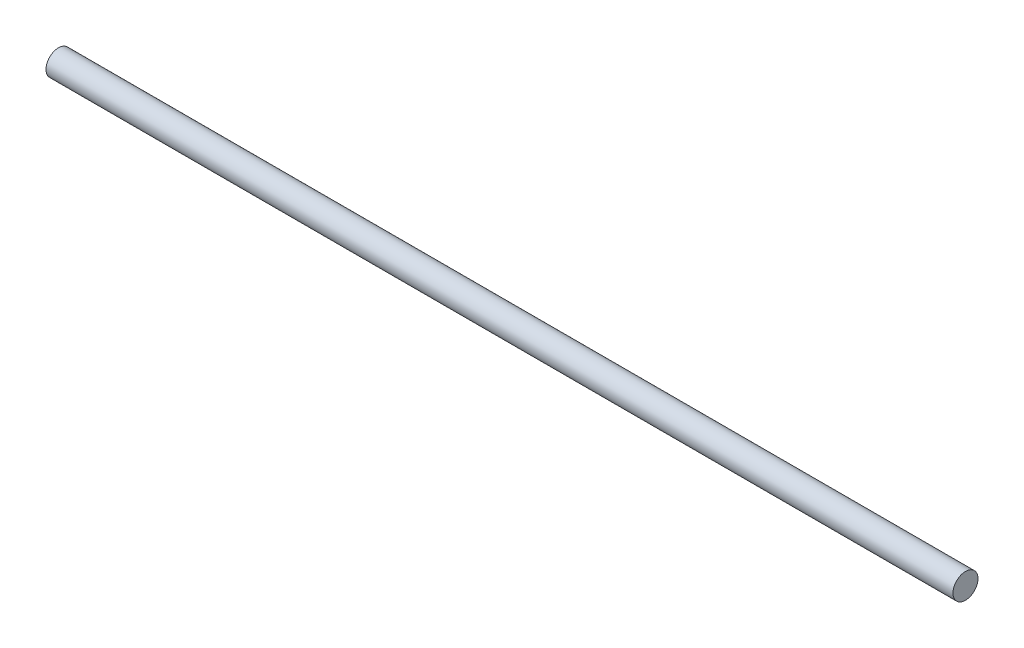
ISO-10303-21;
HEADER;
FILE_DESCRIPTION(('STEP AP214'),'2;1');
FILE_NAME('part.step','',(''),(''),'','','');
FILE_SCHEMA(('AUTOMOTIVE_DESIGN { 1 0 10303 214 1 1 1 1 }'));
ENDSEC;
DATA;
#1=APPLICATION_CONTEXT('core data for automotive mechanical design processes');
#2=APPLICATION_PROTOCOL_DEFINITION('international standard','automotive_design',2000,#1);
#3=PRODUCT_CONTEXT('',#1,'mechanical');
#4=PRODUCT('Part','Part','',(#3));
#5=PRODUCT_RELATED_PRODUCT_CATEGORY('part','',(#4));
#6=PRODUCT_DEFINITION_FORMATION('','',#4);
#7=PRODUCT_DEFINITION_CONTEXT('part definition',#1,'design');
#8=PRODUCT_DEFINITION('design','',#6,#7);
#9=PRODUCT_DEFINITION_SHAPE('','',#8);
#10=(LENGTH_UNIT() NAMED_UNIT(*) SI_UNIT(.MILLI.,.METRE.));
#11=(NAMED_UNIT(*) PLANE_ANGLE_UNIT() SI_UNIT($,.RADIAN.));
#12=(NAMED_UNIT(*) SI_UNIT($,.STERADIAN.) SOLID_ANGLE_UNIT());
#13=UNCERTAINTY_MEASURE_WITH_UNIT(LENGTH_MEASURE(1.E-05),#10,'distance_accuracy_value','');
#14=(GEOMETRIC_REPRESENTATION_CONTEXT(3) GLOBAL_UNCERTAINTY_ASSIGNED_CONTEXT((#13)) GLOBAL_UNIT_ASSIGNED_CONTEXT((#10,
#11,#12)) REPRESENTATION_CONTEXT('',''));
#15=CARTESIAN_POINT('',(0.,0.,0.));
#16=DIRECTION('',(0.,0.,1.));
#17=DIRECTION('',(1.,0.,0.));
#18=AXIS2_PLACEMENT_3D('',#15,#16,#17);
#19=CARTESIAN_POINT('',(290.,0.,0.));
#20=DIRECTION('',(-1.,0.,0.));
#21=DIRECTION('',(0.,0.,1.));
#22=AXIS2_PLACEMENT_3D('',#19,#20,#21);
#23=CYLINDRICAL_SURFACE('',#22,4.);
#24=CARTESIAN_POINT('',(290.,0.,0.));
#25=DIRECTION('',(1.,0.,0.));
#26=DIRECTION('',(0.,0.,-1.));
#27=AXIS2_PLACEMENT_3D('',#24,#25,#26);
#28=CIRCLE('',#27,4.);
#29=CARTESIAN_POINT('',(290.,0.,-4.));
#30=VERTEX_POINT('',#29);
#31=EDGE_CURVE('E10',#30,#30,#28,.T.);
#32=ORIENTED_EDGE('',*,*,#31,.F.);
#33=EDGE_LOOP('',(#32));
#34=FACE_BOUND('',#33,.T.);
#35=CARTESIAN_POINT('',(0.,0.,0.));
#36=DIRECTION('',(1.,0.,0.));
#37=DIRECTION('',(0.,0.,-1.));
#38=AXIS2_PLACEMENT_3D('',#35,#36,#37);
#39=CIRCLE('',#38,4.);
#40=CARTESIAN_POINT('',(0.,0.,-4.));
#41=VERTEX_POINT('',#40);
#42=EDGE_CURVE('E40',#41,#41,#39,.T.);
#43=ORIENTED_EDGE('',*,*,#42,.T.);
#44=EDGE_LOOP('',(#43));
#45=FACE_BOUND('',#44,.T.);
#46=ADVANCED_FACE('F37',(#34,#45),#23,.T.);
#47=CARTESIAN_POINT('',(290.,0.,0.));
#48=DIRECTION('',(1.,0.,0.));
#49=DIRECTION('',(0.,0.,-1.));
#50=AXIS2_PLACEMENT_3D('',#47,#48,#49);
#51=PLANE('',#50);
#52=ORIENTED_EDGE('',*,*,#31,.T.);
#53=EDGE_LOOP('',(#52));
#54=FACE_BOUND('',#53,.T.);
#55=ADVANCED_FACE('F54',(#54),#51,.T.);
#56=CARTESIAN_POINT('',(0.,0.,0.));
#57=DIRECTION('',(1.,0.,0.));
#58=DIRECTION('',(0.,0.,-1.));
#59=AXIS2_PLACEMENT_3D('',#56,#57,#58);
#60=PLANE('',#59);
#61=ORIENTED_EDGE('',*,*,#42,.F.);
#62=EDGE_LOOP('',(#61));
#63=FACE_BOUND('',#62,.T.);
#64=ADVANCED_FACE('F52',(#63),#60,.F.);
#65=CLOSED_SHELL('',(#46,#55,#64));
#66=MANIFOLD_SOLID_BREP('B2',#65);
#67=ADVANCED_BREP_SHAPE_REPRESENTATION('',(#18,#66),#14);
#68=SHAPE_DEFINITION_REPRESENTATION(#9,#67);
ENDSEC;
END-ISO-10303-21;
